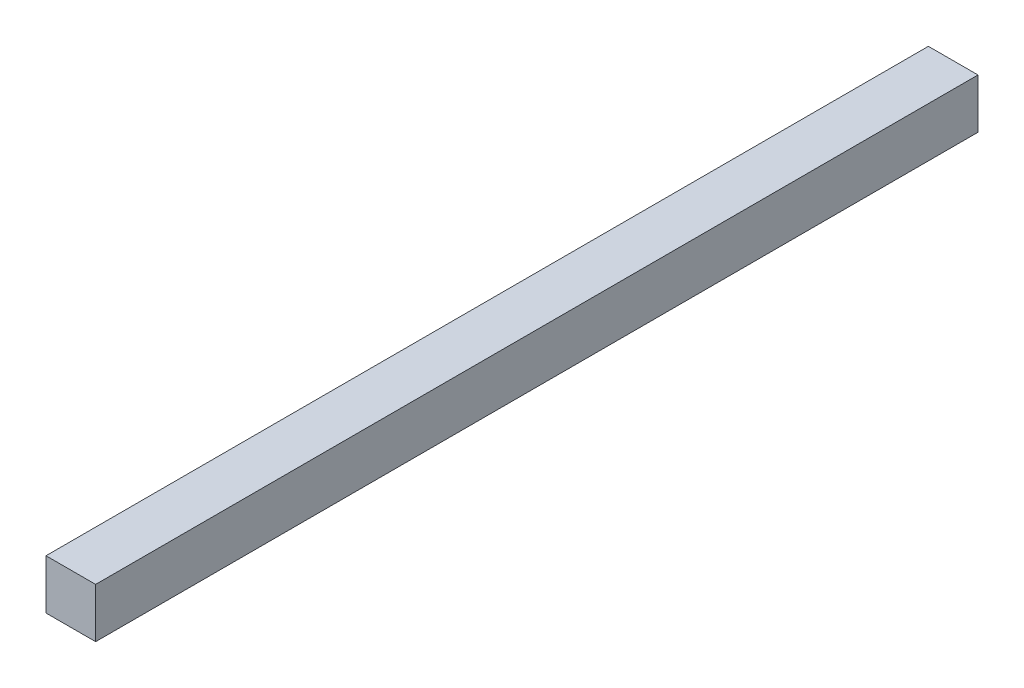
ISO-10303-21;
HEADER;
FILE_DESCRIPTION(('STEP AP214'),'2;1');
FILE_NAME('part.step','',(''),(''),'','','');
FILE_SCHEMA(('AUTOMOTIVE_DESIGN { 1 0 10303 214 1 1 1 1 }'));
ENDSEC;
DATA;
#1=APPLICATION_CONTEXT('core data for automotive mechanical design processes');
#2=APPLICATION_PROTOCOL_DEFINITION('international standard','automotive_design',2000,#1);
#3=PRODUCT_CONTEXT('',#1,'mechanical');
#4=PRODUCT('Part','Part','',(#3));
#5=PRODUCT_RELATED_PRODUCT_CATEGORY('part','',(#4));
#6=PRODUCT_DEFINITION_FORMATION('','',#4);
#7=PRODUCT_DEFINITION_CONTEXT('part definition',#1,'design');
#8=PRODUCT_DEFINITION('design','',#6,#7);
#9=PRODUCT_DEFINITION_SHAPE('','',#8);
#10=(LENGTH_UNIT() NAMED_UNIT(*) SI_UNIT(.MILLI.,.METRE.));
#11=(NAMED_UNIT(*) PLANE_ANGLE_UNIT() SI_UNIT($,.RADIAN.));
#12=(NAMED_UNIT(*) SI_UNIT($,.STERADIAN.) SOLID_ANGLE_UNIT());
#13=UNCERTAINTY_MEASURE_WITH_UNIT(LENGTH_MEASURE(1.E-05),#10,'distance_accuracy_value','');
#14=(GEOMETRIC_REPRESENTATION_CONTEXT(3) GLOBAL_UNCERTAINTY_ASSIGNED_CONTEXT((#13)) GLOBAL_UNIT_ASSIGNED_CONTEXT((#10,
#11,#12)) REPRESENTATION_CONTEXT('',''));
#15=CARTESIAN_POINT('',(0.,0.,0.));
#16=DIRECTION('',(0.,0.,1.));
#17=DIRECTION('',(1.,0.,0.));
#18=AXIS2_PLACEMENT_3D('',#15,#16,#17);
#19=CARTESIAN_POINT('',(10.,-10.,355.6));
#20=DIRECTION('',(-1.,0.,0.));
#21=DIRECTION('',(0.,0.,1.));
#22=AXIS2_PLACEMENT_3D('',#19,#20,#21);
#23=PLANE('',#22);
#24=DIRECTION('',(0.,1.,0.));
#25=VECTOR('',#24,1.);
#26=CARTESIAN_POINT('',(10.,-10.,0.));
#27=LINE('',#26,#25);
#28=CARTESIAN_POINT('',(10.,-10.,0.));
#29=VERTEX_POINT('',#28);
#30=CARTESIAN_POINT('',(10.,10.,0.));
#31=VERTEX_POINT('',#30);
#32=EDGE_CURVE('E105',#29,#31,#27,.T.);
#33=ORIENTED_EDGE('',*,*,#32,.T.);
#34=DIRECTION('',(0.,0.,-1.));
#35=VECTOR('',#34,1.);
#36=CARTESIAN_POINT('',(10.,10.,355.6));
#37=LINE('',#36,#35);
#38=CARTESIAN_POINT('',(10.,10.,355.6));
#39=VERTEX_POINT('',#38);
#40=EDGE_CURVE('E11',#39,#31,#37,.T.);
#41=ORIENTED_EDGE('',*,*,#40,.F.);
#42=DIRECTION('',(0.,1.,0.));
#43=VECTOR('',#42,1.);
#44=CARTESIAN_POINT('',(10.,-10.,355.6));
#45=LINE('',#44,#43);
#46=CARTESIAN_POINT('',(10.,-10.,355.6));
#47=VERTEX_POINT('',#46);
#48=EDGE_CURVE('E89',#47,#39,#45,.T.);
#49=ORIENTED_EDGE('',*,*,#48,.F.);
#50=DIRECTION('',(0.,0.,-1.));
#51=VECTOR('',#50,1.);
#52=CARTESIAN_POINT('',(10.,-10.,355.6));
#53=LINE('',#52,#51);
#54=EDGE_CURVE('E97',#47,#29,#53,.T.);
#55=ORIENTED_EDGE('',*,*,#54,.T.);
#56=EDGE_LOOP('',(#33,#41,#49,#55));
#57=FACE_BOUND('',#56,.T.);
#58=ADVANCED_FACE('F39',(#57),#23,.F.);
#59=CARTESIAN_POINT('',(-10.,10.,355.6));
#60=DIRECTION('',(0.,-1.,0.));
#61=DIRECTION('',(0.,0.,-1.));
#62=AXIS2_PLACEMENT_3D('',#59,#60,#61);
#63=PLANE('',#62);
#64=DIRECTION('',(-1.,0.,0.));
#65=VECTOR('',#64,1.);
#66=CARTESIAN_POINT('',(-10.,10.,0.));
#67=LINE('',#66,#65);
#68=CARTESIAN_POINT('',(-10.,10.,0.));
#69=VERTEX_POINT('',#68);
#70=EDGE_CURVE('E92',#31,#69,#67,.T.);
#71=ORIENTED_EDGE('',*,*,#70,.T.);
#72=DIRECTION('',(0.,0.,-1.));
#73=VECTOR('',#72,1.);
#74=CARTESIAN_POINT('',(-10.,10.,355.6));
#75=LINE('',#74,#73);
#76=CARTESIAN_POINT('',(-10.,10.,355.6));
#77=VERTEX_POINT('',#76);
#78=EDGE_CURVE('E50',#77,#69,#75,.T.);
#79=ORIENTED_EDGE('',*,*,#78,.F.);
#80=DIRECTION('',(-1.,0.,0.));
#81=VECTOR('',#80,1.);
#82=CARTESIAN_POINT('',(-10.,10.,355.6));
#83=LINE('',#82,#81);
#84=EDGE_CURVE('E82',#39,#77,#83,.T.);
#85=ORIENTED_EDGE('',*,*,#84,.F.);
#86=ORIENTED_EDGE('',*,*,#40,.T.);
#87=EDGE_LOOP('',(#71,#79,#85,#86));
#88=FACE_BOUND('',#87,.T.);
#89=ADVANCED_FACE('F93',(#88),#63,.F.);
#90=CARTESIAN_POINT('',(-10.,-10.,355.6));
#91=DIRECTION('',(1.,0.,0.));
#92=DIRECTION('',(0.,0.,-1.));
#93=AXIS2_PLACEMENT_3D('',#90,#91,#92);
#94=PLANE('',#93);
#95=DIRECTION('',(0.,-1.,0.));
#96=VECTOR('',#95,1.);
#97=CARTESIAN_POINT('',(-10.,-10.,0.));
#98=LINE('',#97,#96);
#99=CARTESIAN_POINT('',(-10.,-10.,0.));
#100=VERTEX_POINT('',#99);
#101=EDGE_CURVE('E75',#69,#100,#98,.T.);
#102=ORIENTED_EDGE('',*,*,#101,.T.);
#103=DIRECTION('',(0.,0.,-1.));
#104=VECTOR('',#103,1.);
#105=CARTESIAN_POINT('',(-10.,-10.,355.6));
#106=LINE('',#105,#104);
#107=CARTESIAN_POINT('',(-10.,-10.,355.6));
#108=VERTEX_POINT('',#107);
#109=EDGE_CURVE('E94',#108,#100,#106,.T.);
#110=ORIENTED_EDGE('',*,*,#109,.F.);
#111=DIRECTION('',(0.,-1.,0.));
#112=VECTOR('',#111,1.);
#113=CARTESIAN_POINT('',(-10.,-10.,355.6));
#114=LINE('',#113,#112);
#115=EDGE_CURVE('E88',#77,#108,#114,.T.);
#116=ORIENTED_EDGE('',*,*,#115,.F.);
#117=ORIENTED_EDGE('',*,*,#78,.T.);
#118=EDGE_LOOP('',(#102,#110,#116,#117));
#119=FACE_BOUND('',#118,.T.);
#120=ADVANCED_FACE('F96',(#119),#94,.F.);
#121=CARTESIAN_POINT('',(-10.,-10.,355.6));
#122=DIRECTION('',(0.,1.,0.));
#123=DIRECTION('',(0.,0.,1.));
#124=AXIS2_PLACEMENT_3D('',#121,#122,#123);
#125=PLANE('',#124);
#126=DIRECTION('',(1.,0.,0.));
#127=VECTOR('',#126,1.);
#128=CARTESIAN_POINT('',(-10.,-10.,0.));
#129=LINE('',#128,#127);
#130=EDGE_CURVE('E76',#100,#29,#129,.T.);
#131=ORIENTED_EDGE('',*,*,#130,.T.);
#132=ORIENTED_EDGE('',*,*,#54,.F.);
#133=DIRECTION('',(1.,0.,0.));
#134=VECTOR('',#133,1.);
#135=CARTESIAN_POINT('',(-10.,-10.,355.6));
#136=LINE('',#135,#134);
#137=EDGE_CURVE('E54',#108,#47,#136,.T.);
#138=ORIENTED_EDGE('',*,*,#137,.F.);
#139=ORIENTED_EDGE('',*,*,#109,.T.);
#140=EDGE_LOOP('',(#131,#132,#138,#139));
#141=FACE_BOUND('',#140,.T.);
#142=ADVANCED_FACE('F107',(#141),#125,.F.);
#143=CARTESIAN_POINT('',(0.,0.,355.6));
#144=DIRECTION('',(0.,0.,-1.));
#145=DIRECTION('',(-1.,0.,0.));
#146=AXIS2_PLACEMENT_3D('',#143,#144,#145);
#147=PLANE('',#146);
#148=ORIENTED_EDGE('',*,*,#48,.T.);
#149=ORIENTED_EDGE('',*,*,#84,.T.);
#150=ORIENTED_EDGE('',*,*,#115,.T.);
#151=ORIENTED_EDGE('',*,*,#137,.T.);
#152=EDGE_LOOP('',(#148,#149,#150,#151));
#153=FACE_BOUND('',#152,.T.);
#154=ADVANCED_FACE('F86',(#153),#147,.F.);
#155=CARTESIAN_POINT('',(0.,0.,0.));
#156=DIRECTION('',(0.,0.,-1.));
#157=DIRECTION('',(-1.,0.,0.));
#158=AXIS2_PLACEMENT_3D('',#155,#156,#157);
#159=PLANE('',#158);
#160=ORIENTED_EDGE('',*,*,#32,.F.);
#161=ORIENTED_EDGE('',*,*,#130,.F.);
#162=ORIENTED_EDGE('',*,*,#101,.F.);
#163=ORIENTED_EDGE('',*,*,#70,.F.);
#164=EDGE_LOOP('',(#160,#161,#162,#163));
#165=FACE_BOUND('',#164,.T.);
#166=ADVANCED_FACE('F115',(#165),#159,.T.);
#167=CLOSED_SHELL('',(#58,#89,#120,#142,#154,#166));
#168=MANIFOLD_SOLID_BREP('B2',#167);
#169=ADVANCED_BREP_SHAPE_REPRESENTATION('',(#18,#168),#14);
#170=SHAPE_DEFINITION_REPRESENTATION(#9,#169);
ENDSEC;
END-ISO-10303-21;
